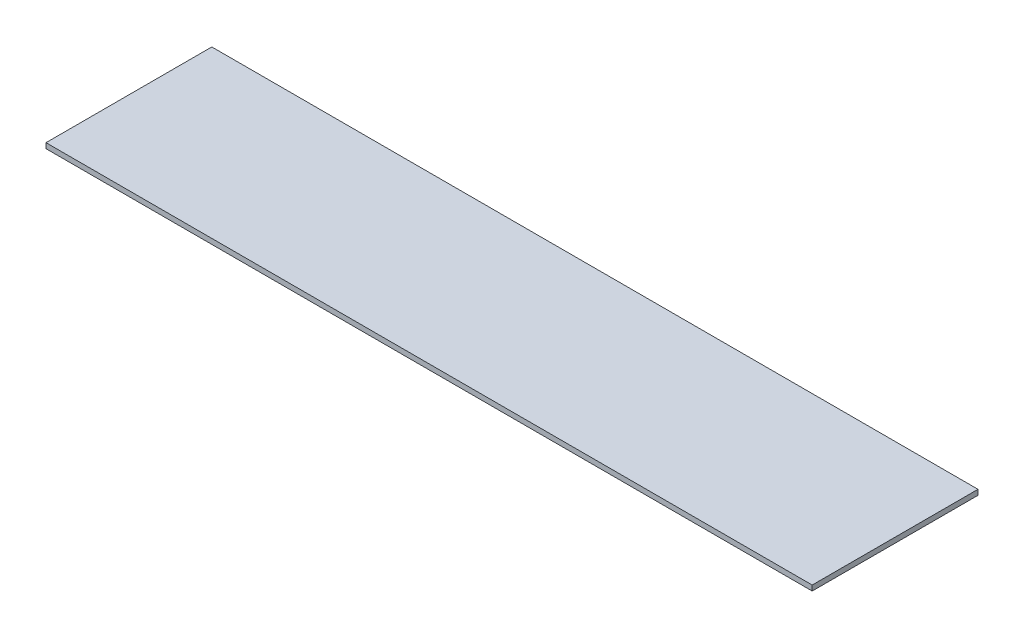
ISO-10303-21;
HEADER;
FILE_DESCRIPTION(('STEP AP214'),'2;1');
FILE_NAME('part.step','',(''),(''),'','','');
FILE_SCHEMA(('AUTOMOTIVE_DESIGN { 1 0 10303 214 1 1 1 1 }'));
ENDSEC;
DATA;
#1=APPLICATION_CONTEXT('core data for automotive mechanical design processes');
#2=APPLICATION_PROTOCOL_DEFINITION('international standard','automotive_design',2000,#1);
#3=PRODUCT_CONTEXT('',#1,'mechanical');
#4=PRODUCT('Part','Part','',(#3));
#5=PRODUCT_RELATED_PRODUCT_CATEGORY('part','',(#4));
#6=PRODUCT_DEFINITION_FORMATION('','',#4);
#7=PRODUCT_DEFINITION_CONTEXT('part definition',#1,'design');
#8=PRODUCT_DEFINITION('design','',#6,#7);
#9=PRODUCT_DEFINITION_SHAPE('','',#8);
#10=(LENGTH_UNIT() NAMED_UNIT(*) SI_UNIT(.MILLI.,.METRE.));
#11=(NAMED_UNIT(*) PLANE_ANGLE_UNIT() SI_UNIT($,.RADIAN.));
#12=(NAMED_UNIT(*) SI_UNIT($,.STERADIAN.) SOLID_ANGLE_UNIT());
#13=UNCERTAINTY_MEASURE_WITH_UNIT(LENGTH_MEASURE(1.E-05),#10,'distance_accuracy_value','');
#14=(GEOMETRIC_REPRESENTATION_CONTEXT(3) GLOBAL_UNCERTAINTY_ASSIGNED_CONTEXT((#13)) GLOBAL_UNIT_ASSIGNED_CONTEXT((#10,
#11,#12)) REPRESENTATION_CONTEXT('',''));
#15=CARTESIAN_POINT('',(0.,0.,0.));
#16=DIRECTION('',(0.,0.,1.));
#17=DIRECTION('',(1.,0.,0.));
#18=AXIS2_PLACEMENT_3D('',#15,#16,#17);
#19=CARTESIAN_POINT('',(-219.5,3.,47.5000000000001));
#20=DIRECTION('',(1.,0.,0.));
#21=DIRECTION('',(0.,0.,-1.));
#22=AXIS2_PLACEMENT_3D('',#19,#20,#21);
#23=PLANE('',#22);
#24=DIRECTION('',(0.,0.,1.));
#25=VECTOR('',#24,1.);
#26=CARTESIAN_POINT('',(-219.5,0.,47.5000000000001));
#27=LINE('',#26,#25);
#28=CARTESIAN_POINT('',(-219.5,0.,-47.5));
#29=VERTEX_POINT('',#28);
#30=CARTESIAN_POINT('',(-219.5,0.,47.5000000000001));
#31=VERTEX_POINT('',#30);
#32=EDGE_CURVE('E95',#29,#31,#27,.T.);
#33=ORIENTED_EDGE('',*,*,#32,.T.);
#34=DIRECTION('',(0.,-1.,0.));
#35=VECTOR('',#34,1.);
#36=CARTESIAN_POINT('',(-219.5,3.,47.5000000000001));
#37=LINE('',#36,#35);
#38=CARTESIAN_POINT('',(-219.5,3.,47.5000000000001));
#39=VERTEX_POINT('',#38);
#40=EDGE_CURVE('E11',#39,#31,#37,.T.);
#41=ORIENTED_EDGE('',*,*,#40,.F.);
#42=DIRECTION('',(0.,0.,1.));
#43=VECTOR('',#42,1.);
#44=CARTESIAN_POINT('',(-219.5,3.,47.5000000000001));
#45=LINE('',#44,#43);
#46=CARTESIAN_POINT('',(-219.5,3.,-47.5));
#47=VERTEX_POINT('',#46);
#48=EDGE_CURVE('E83',#47,#39,#45,.T.);
#49=ORIENTED_EDGE('',*,*,#48,.F.);
#50=DIRECTION('',(0.,-1.,0.));
#51=VECTOR('',#50,1.);
#52=CARTESIAN_POINT('',(-219.5,3.,-47.5));
#53=LINE('',#52,#51);
#54=EDGE_CURVE('E91',#47,#29,#53,.T.);
#55=ORIENTED_EDGE('',*,*,#54,.T.);
#56=EDGE_LOOP('',(#33,#41,#49,#55));
#57=FACE_BOUND('',#56,.T.);
#58=ADVANCED_FACE('F32',(#57),#23,.F.);
#59=CARTESIAN_POINT('',(219.5,3.,47.5));
#60=DIRECTION('',(0.,0.,-1.));
#61=DIRECTION('',(-1.,0.,0.));
#62=AXIS2_PLACEMENT_3D('',#59,#60,#61);
#63=PLANE('',#62);
#64=DIRECTION('',(1.,0.,0.));
#65=VECTOR('',#64,1.);
#66=CARTESIAN_POINT('',(219.5,0.,47.5));
#67=LINE('',#66,#65);
#68=CARTESIAN_POINT('',(219.5,0.,47.5));
#69=VERTEX_POINT('',#68);
#70=EDGE_CURVE('E87',#31,#69,#67,.T.);
#71=ORIENTED_EDGE('',*,*,#70,.T.);
#72=DIRECTION('',(0.,-1.,0.));
#73=VECTOR('',#72,1.);
#74=CARTESIAN_POINT('',(219.5,3.,47.5));
#75=LINE('',#74,#73);
#76=CARTESIAN_POINT('',(219.5,3.,47.5));
#77=VERTEX_POINT('',#76);
#78=EDGE_CURVE('E40',#77,#69,#75,.T.);
#79=ORIENTED_EDGE('',*,*,#78,.F.);
#80=DIRECTION('',(1.,0.,0.));
#81=VECTOR('',#80,1.);
#82=CARTESIAN_POINT('',(219.5,3.,47.5));
#83=LINE('',#82,#81);
#84=EDGE_CURVE('E78',#39,#77,#83,.T.);
#85=ORIENTED_EDGE('',*,*,#84,.F.);
#86=ORIENTED_EDGE('',*,*,#40,.T.);
#87=EDGE_LOOP('',(#71,#79,#85,#86));
#88=FACE_BOUND('',#87,.T.);
#89=ADVANCED_FACE('F86',(#88),#63,.F.);
#90=CARTESIAN_POINT('',(219.5,3.,47.5));
#91=DIRECTION('',(-1.,0.,0.));
#92=DIRECTION('',(0.,0.,1.));
#93=AXIS2_PLACEMENT_3D('',#90,#91,#92);
#94=PLANE('',#93);
#95=DIRECTION('',(0.,0.,-1.));
#96=VECTOR('',#95,1.);
#97=CARTESIAN_POINT('',(219.5,0.,47.5));
#98=LINE('',#97,#96);
#99=CARTESIAN_POINT('',(219.5,0.,-47.5));
#100=VERTEX_POINT('',#99);
#101=EDGE_CURVE('E65',#69,#100,#98,.T.);
#102=ORIENTED_EDGE('',*,*,#101,.T.);
#103=DIRECTION('',(0.,-1.,0.));
#104=VECTOR('',#103,1.);
#105=CARTESIAN_POINT('',(219.5,3.,-47.5));
#106=LINE('',#105,#104);
#107=CARTESIAN_POINT('',(219.5,3.,-47.5));
#108=VERTEX_POINT('',#107);
#109=EDGE_CURVE('E88',#108,#100,#106,.T.);
#110=ORIENTED_EDGE('',*,*,#109,.F.);
#111=DIRECTION('',(0.,0.,-1.));
#112=VECTOR('',#111,1.);
#113=CARTESIAN_POINT('',(219.5,3.,47.5));
#114=LINE('',#113,#112);
#115=EDGE_CURVE('E81',#77,#108,#114,.T.);
#116=ORIENTED_EDGE('',*,*,#115,.F.);
#117=ORIENTED_EDGE('',*,*,#78,.T.);
#118=EDGE_LOOP('',(#102,#110,#116,#117));
#119=FACE_BOUND('',#118,.T.);
#120=ADVANCED_FACE('F89',(#119),#94,.F.);
#121=CARTESIAN_POINT('',(219.5,3.,-47.5));
#122=DIRECTION('',(0.,0.,1.));
#123=DIRECTION('',(1.,0.,0.));
#124=AXIS2_PLACEMENT_3D('',#121,#122,#123);
#125=PLANE('',#124);
#126=DIRECTION('',(-1.,0.,0.));
#127=VECTOR('',#126,1.);
#128=CARTESIAN_POINT('',(219.5,0.,-47.5));
#129=LINE('',#128,#127);
#130=EDGE_CURVE('E71',#100,#29,#129,.T.);
#131=ORIENTED_EDGE('',*,*,#130,.T.);
#132=ORIENTED_EDGE('',*,*,#54,.F.);
#133=DIRECTION('',(-1.,0.,0.));
#134=VECTOR('',#133,1.);
#135=CARTESIAN_POINT('',(219.5,3.,-47.5));
#136=LINE('',#135,#134);
#137=EDGE_CURVE('E48',#108,#47,#136,.T.);
#138=ORIENTED_EDGE('',*,*,#137,.F.);
#139=ORIENTED_EDGE('',*,*,#109,.T.);
#140=EDGE_LOOP('',(#131,#132,#138,#139));
#141=FACE_BOUND('',#140,.T.);
#142=ADVANCED_FACE('F102',(#141),#125,.F.);
#143=CARTESIAN_POINT('',(0.,3.,0.));
#144=DIRECTION('',(0.,1.,0.));
#145=DIRECTION('',(0.,0.,1.));
#146=AXIS2_PLACEMENT_3D('',#143,#144,#145);
#147=PLANE('',#146);
#148=ORIENTED_EDGE('',*,*,#48,.T.);
#149=ORIENTED_EDGE('',*,*,#84,.T.);
#150=ORIENTED_EDGE('',*,*,#115,.T.);
#151=ORIENTED_EDGE('',*,*,#137,.T.);
#152=EDGE_LOOP('',(#148,#149,#150,#151));
#153=FACE_BOUND('',#152,.T.);
#154=ADVANCED_FACE('F79',(#153),#147,.T.);
#155=CARTESIAN_POINT('',(0.,0.,0.));
#156=DIRECTION('',(0.,1.,0.));
#157=DIRECTION('',(0.,0.,1.));
#158=AXIS2_PLACEMENT_3D('',#155,#156,#157);
#159=PLANE('',#158);
#160=ORIENTED_EDGE('',*,*,#32,.F.);
#161=ORIENTED_EDGE('',*,*,#130,.F.);
#162=ORIENTED_EDGE('',*,*,#101,.F.);
#163=ORIENTED_EDGE('',*,*,#70,.F.);
#164=EDGE_LOOP('',(#160,#161,#162,#163));
#165=FACE_BOUND('',#164,.T.);
#166=ADVANCED_FACE('F105',(#165),#159,.F.);
#167=CLOSED_SHELL('',(#58,#89,#120,#142,#154,#166));
#168=MANIFOLD_SOLID_BREP('B2',#167);
#169=ADVANCED_BREP_SHAPE_REPRESENTATION('',(#18,#168),#14);
#170=SHAPE_DEFINITION_REPRESENTATION(#9,#169);
ENDSEC;
END-ISO-10303-21;
